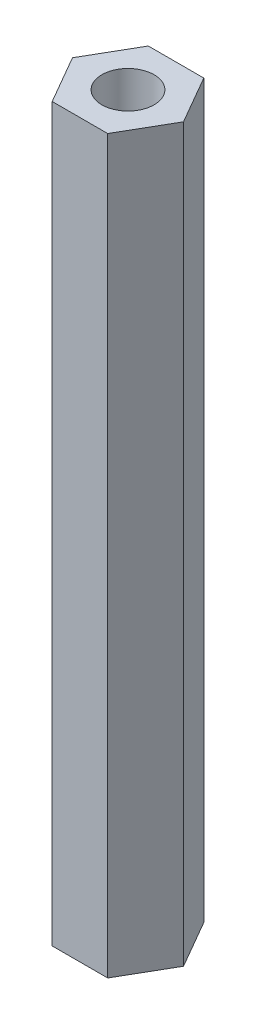
ISO-10303-21;
HEADER;
FILE_DESCRIPTION(('STEP AP214'),'2;1');
FILE_NAME('part.step','',(''),(''),'','','');
FILE_SCHEMA(('AUTOMOTIVE_DESIGN { 1 0 10303 214 1 1 1 1 }'));
ENDSEC;
DATA;
#1=APPLICATION_CONTEXT('core data for automotive mechanical design processes');
#2=APPLICATION_PROTOCOL_DEFINITION('international standard','automotive_design',2000,#1);
#3=PRODUCT_CONTEXT('',#1,'mechanical');
#4=PRODUCT('Part','Part','',(#3));
#5=PRODUCT_RELATED_PRODUCT_CATEGORY('part','',(#4));
#6=PRODUCT_DEFINITION_FORMATION('','',#4);
#7=PRODUCT_DEFINITION_CONTEXT('part definition',#1,'design');
#8=PRODUCT_DEFINITION('design','',#6,#7);
#9=PRODUCT_DEFINITION_SHAPE('','',#8);
#10=(LENGTH_UNIT() NAMED_UNIT(*) SI_UNIT(.MILLI.,.METRE.));
#11=(NAMED_UNIT(*) PLANE_ANGLE_UNIT() SI_UNIT($,.RADIAN.));
#12=(NAMED_UNIT(*) SI_UNIT($,.STERADIAN.) SOLID_ANGLE_UNIT());
#13=UNCERTAINTY_MEASURE_WITH_UNIT(LENGTH_MEASURE(1.E-05),#10,'distance_accuracy_value','');
#14=(GEOMETRIC_REPRESENTATION_CONTEXT(3) GLOBAL_UNCERTAINTY_ASSIGNED_CONTEXT((#13)) GLOBAL_UNIT_ASSIGNED_CONTEXT((#10,
#11,#12)) REPRESENTATION_CONTEXT('',''));
#15=CARTESIAN_POINT('',(0.,0.,0.));
#16=DIRECTION('',(0.,0.,1.));
#17=DIRECTION('',(1.,0.,0.));
#18=AXIS2_PLACEMENT_3D('',#15,#16,#17);
#19=CARTESIAN_POINT('',(-1.32790561913614,17.5,2.3));
#20=DIRECTION('',(0.,0.,-1.));
#21=DIRECTION('',(-1.,0.,0.));
#22=AXIS2_PLACEMENT_3D('',#19,#20,#21);
#23=PLANE('',#22);
#24=DIRECTION('',(1.,0.,0.));
#25=VECTOR('',#24,1.);
#26=CARTESIAN_POINT('',(-1.32790561913614,-17.5,2.3));
#27=LINE('',#26,#25);
#28=CARTESIAN_POINT('',(-1.32790561913614,-17.5,2.3));
#29=VERTEX_POINT('',#28);
#30=CARTESIAN_POINT('',(1.32790561913614,-17.5,2.3));
#31=VERTEX_POINT('',#30);
#32=EDGE_CURVE('E121',#29,#31,#27,.T.);
#33=ORIENTED_EDGE('',*,*,#32,.T.);
#34=DIRECTION('',(0.,-1.,0.));
#35=VECTOR('',#34,1.);
#36=CARTESIAN_POINT('',(1.32790561913614,17.5,2.3));
#37=LINE('',#36,#35);
#38=CARTESIAN_POINT('',(1.32790561913614,17.5,2.3));
#39=VERTEX_POINT('',#38);
#40=EDGE_CURVE('E11',#39,#31,#37,.T.);
#41=ORIENTED_EDGE('',*,*,#40,.F.);
#42=DIRECTION('',(1.,0.,0.));
#43=VECTOR('',#42,1.);
#44=CARTESIAN_POINT('',(-1.32790561913614,17.5,2.3));
#45=LINE('',#44,#43);
#46=CARTESIAN_POINT('',(-1.32790561913614,17.5,2.3));
#47=VERTEX_POINT('',#46);
#48=EDGE_CURVE('E132',#47,#39,#45,.T.);
#49=ORIENTED_EDGE('',*,*,#48,.F.);
#50=DIRECTION('',(0.,-1.,0.));
#51=VECTOR('',#50,1.);
#52=CARTESIAN_POINT('',(-1.32790561913614,17.5,2.3));
#53=LINE('',#52,#51);
#54=EDGE_CURVE('E117',#47,#29,#53,.T.);
#55=ORIENTED_EDGE('',*,*,#54,.T.);
#56=EDGE_LOOP('',(#33,#41,#49,#55));
#57=FACE_BOUND('',#56,.T.);
#58=ADVANCED_FACE('F37',(#57),#23,.F.);
#59=CARTESIAN_POINT('',(1.32790561913614,17.5,2.3));
#60=DIRECTION('',(-0.866025403784439,0.,-0.5));
#61=DIRECTION('',(-0.5,0.,0.866025403784439));
#62=AXIS2_PLACEMENT_3D('',#59,#60,#61);
#63=PLANE('',#62);
#64=DIRECTION('',(0.5,0.,-0.866025403784438));
#65=VECTOR('',#64,1.);
#66=CARTESIAN_POINT('',(1.32790561913614,-17.5,2.3));
#67=LINE('',#66,#65);
#68=CARTESIAN_POINT('',(2.65581123827228,-17.5,0.));
#69=VERTEX_POINT('',#68);
#70=EDGE_CURVE('E124',#31,#69,#67,.T.);
#71=ORIENTED_EDGE('',*,*,#70,.T.);
#72=DIRECTION('',(0.,-1.,0.));
#73=VECTOR('',#72,1.);
#74=CARTESIAN_POINT('',(2.65581123827228,17.5,0.));
#75=LINE('',#74,#73);
#76=CARTESIAN_POINT('',(2.65581123827228,17.5,0.));
#77=VERTEX_POINT('',#76);
#78=EDGE_CURVE('E45',#77,#69,#75,.T.);
#79=ORIENTED_EDGE('',*,*,#78,.F.);
#80=DIRECTION('',(0.5,0.,-0.866025403784438));
#81=VECTOR('',#80,1.);
#82=CARTESIAN_POINT('',(1.32790561913614,17.5,2.3));
#83=LINE('',#82,#81);
#84=EDGE_CURVE('E90',#39,#77,#83,.T.);
#85=ORIENTED_EDGE('',*,*,#84,.F.);
#86=ORIENTED_EDGE('',*,*,#40,.T.);
#87=EDGE_LOOP('',(#71,#79,#85,#86));
#88=FACE_BOUND('',#87,.T.);
#89=ADVANCED_FACE('F157',(#88),#63,.F.);
#90=CARTESIAN_POINT('',(2.65581123827228,17.5,0.));
#91=DIRECTION('',(-0.866025403784439,0.,0.5));
#92=DIRECTION('',(0.5,0.,0.866025403784439));
#93=AXIS2_PLACEMENT_3D('',#90,#91,#92);
#94=PLANE('',#93);
#95=DIRECTION('',(-0.5,0.,-0.866025403784439));
#96=VECTOR('',#95,1.);
#97=CARTESIAN_POINT('',(2.65581123827228,-17.5,0.));
#98=LINE('',#97,#96);
#99=CARTESIAN_POINT('',(1.32790561913614,-17.5,-2.3));
#100=VERTEX_POINT('',#99);
#101=EDGE_CURVE('E127',#69,#100,#98,.T.);
#102=ORIENTED_EDGE('',*,*,#101,.T.);
#103=DIRECTION('',(0.,-1.,0.));
#104=VECTOR('',#103,1.);
#105=CARTESIAN_POINT('',(1.32790561913614,17.5,-2.3));
#106=LINE('',#105,#104);
#107=CARTESIAN_POINT('',(1.32790561913614,17.5,-2.3));
#108=VERTEX_POINT('',#107);
#109=EDGE_CURVE('E112',#108,#100,#106,.T.);
#110=ORIENTED_EDGE('',*,*,#109,.F.);
#111=DIRECTION('',(-0.5,0.,-0.866025403784439));
#112=VECTOR('',#111,1.);
#113=CARTESIAN_POINT('',(2.65581123827228,17.5,0.));
#114=LINE('',#113,#112);
#115=EDGE_CURVE('E103',#77,#108,#114,.T.);
#116=ORIENTED_EDGE('',*,*,#115,.F.);
#117=ORIENTED_EDGE('',*,*,#78,.T.);
#118=EDGE_LOOP('',(#102,#110,#116,#117));
#119=FACE_BOUND('',#118,.T.);
#120=ADVANCED_FACE('F138',(#119),#94,.F.);
#121=CARTESIAN_POINT('',(1.32790561913614,17.5,-2.3));
#122=DIRECTION('',(0.,0.,1.));
#123=DIRECTION('',(1.,0.,0.));
#124=AXIS2_PLACEMENT_3D('',#121,#122,#123);
#125=PLANE('',#124);
#126=DIRECTION('',(-1.,0.,0.));
#127=VECTOR('',#126,1.);
#128=CARTESIAN_POINT('',(1.32790561913614,-17.5,-2.3));
#129=LINE('',#128,#127);
#130=CARTESIAN_POINT('',(-1.32790561913614,-17.5,-2.3));
#131=VERTEX_POINT('',#130);
#132=EDGE_CURVE('E111',#100,#131,#129,.T.);
#133=ORIENTED_EDGE('',*,*,#132,.T.);
#134=DIRECTION('',(0.,-1.,0.));
#135=VECTOR('',#134,1.);
#136=CARTESIAN_POINT('',(-1.32790561913614,17.5,-2.3));
#137=LINE('',#136,#135);
#138=CARTESIAN_POINT('',(-1.32790561913614,17.5,-2.3));
#139=VERTEX_POINT('',#138);
#140=EDGE_CURVE('E108',#139,#131,#137,.T.);
#141=ORIENTED_EDGE('',*,*,#140,.F.);
#142=DIRECTION('',(-1.,0.,0.));
#143=VECTOR('',#142,1.);
#144=CARTESIAN_POINT('',(1.32790561913614,17.5,-2.3));
#145=LINE('',#144,#143);
#146=EDGE_CURVE('E97',#108,#139,#145,.T.);
#147=ORIENTED_EDGE('',*,*,#146,.F.);
#148=ORIENTED_EDGE('',*,*,#109,.T.);
#149=EDGE_LOOP('',(#133,#141,#147,#148));
#150=FACE_BOUND('',#149,.T.);
#151=ADVANCED_FACE('F109',(#150),#125,.F.);
#152=CARTESIAN_POINT('',(-1.32790561913614,17.5,-2.3));
#153=DIRECTION('',(0.866025403784439,0.,0.5));
#154=DIRECTION('',(0.5,0.,-0.866025403784439));
#155=AXIS2_PLACEMENT_3D('',#152,#153,#154);
#156=PLANE('',#155);
#157=DIRECTION('',(-0.5,0.,0.866025403784439));
#158=VECTOR('',#157,1.);
#159=CARTESIAN_POINT('',(-1.32790561913614,-17.5,-2.3));
#160=LINE('',#159,#158);
#161=CARTESIAN_POINT('',(-2.65581123827228,-17.5,0.));
#162=VERTEX_POINT('',#161);
#163=EDGE_CURVE('E76',#131,#162,#160,.T.);
#164=ORIENTED_EDGE('',*,*,#163,.T.);
#165=DIRECTION('',(0.,-1.,0.));
#166=VECTOR('',#165,1.);
#167=CARTESIAN_POINT('',(-2.65581123827228,17.5,0.));
#168=LINE('',#167,#166);
#169=CARTESIAN_POINT('',(-2.65581123827228,17.5,0.));
#170=VERTEX_POINT('',#169);
#171=EDGE_CURVE('E113',#170,#162,#168,.T.);
#172=ORIENTED_EDGE('',*,*,#171,.F.);
#173=DIRECTION('',(-0.5,0.,0.866025403784439));
#174=VECTOR('',#173,1.);
#175=CARTESIAN_POINT('',(-1.32790561913614,17.5,-2.3));
#176=LINE('',#175,#174);
#177=EDGE_CURVE('E101',#139,#170,#176,.T.);
#178=ORIENTED_EDGE('',*,*,#177,.F.);
#179=ORIENTED_EDGE('',*,*,#140,.T.);
#180=EDGE_LOOP('',(#164,#172,#178,#179));
#181=FACE_BOUND('',#180,.T.);
#182=ADVANCED_FACE('F115',(#181),#156,.F.);
#183=CARTESIAN_POINT('',(-2.65581123827228,17.5,0.));
#184=DIRECTION('',(0.866025403784439,0.,-0.5));
#185=DIRECTION('',(-0.5,0.,-0.866025403784439));
#186=AXIS2_PLACEMENT_3D('',#183,#184,#185);
#187=PLANE('',#186);
#188=DIRECTION('',(0.5,0.,0.866025403784439));
#189=VECTOR('',#188,1.);
#190=CARTESIAN_POINT('',(-2.65581123827228,-17.5,0.));
#191=LINE('',#190,#189);
#192=EDGE_CURVE('E82',#162,#29,#191,.T.);
#193=ORIENTED_EDGE('',*,*,#192,.T.);
#194=ORIENTED_EDGE('',*,*,#54,.F.);
#195=DIRECTION('',(0.5,0.,0.866025403784439));
#196=VECTOR('',#195,1.);
#197=CARTESIAN_POINT('',(-2.65581123827228,17.5,0.));
#198=LINE('',#197,#196);
#199=EDGE_CURVE('E53',#170,#47,#198,.T.);
#200=ORIENTED_EDGE('',*,*,#199,.F.);
#201=ORIENTED_EDGE('',*,*,#171,.T.);
#202=EDGE_LOOP('',(#193,#194,#200,#201));
#203=FACE_BOUND('',#202,.T.);
#204=ADVANCED_FACE('F145',(#203),#187,.F.);
#205=CARTESIAN_POINT('',(0.,17.5,0.));
#206=DIRECTION('',(0.,1.,0.));
#207=DIRECTION('',(0.,0.,1.));
#208=AXIS2_PLACEMENT_3D('',#205,#206,#207);
#209=PLANE('',#208);
#210=CARTESIAN_POINT('',(0.,17.5,0.));
#211=DIRECTION('',(0.,1.,0.));
#212=DIRECTION('',(0.,0.,1.));
#213=AXIS2_PLACEMENT_3D('',#210,#211,#212);
#214=CIRCLE('',#213,1.25);
#215=CARTESIAN_POINT('',(0.,17.5,1.25));
#216=VERTEX_POINT('',#215);
#217=EDGE_CURVE('E226',#216,#216,#214,.T.);
#218=ORIENTED_EDGE('',*,*,#217,.F.);
#219=EDGE_LOOP('',(#218));
#220=FACE_BOUND('',#219,.T.);
#221=ORIENTED_EDGE('',*,*,#48,.T.);
#222=ORIENTED_EDGE('',*,*,#84,.T.);
#223=ORIENTED_EDGE('',*,*,#115,.T.);
#224=ORIENTED_EDGE('',*,*,#146,.T.);
#225=ORIENTED_EDGE('',*,*,#177,.T.);
#226=ORIENTED_EDGE('',*,*,#199,.T.);
#227=EDGE_LOOP('',(#221,#222,#223,#224,#225,#226));
#228=FACE_BOUND('',#227,.T.);
#229=ADVANCED_FACE('F99',(#220,#228),#209,.T.);
#230=CARTESIAN_POINT('',(0.,-17.5,0.));
#231=DIRECTION('',(0.,1.,0.));
#232=DIRECTION('',(0.,0.,1.));
#233=AXIS2_PLACEMENT_3D('',#230,#231,#232);
#234=PLANE('',#233);
#235=CARTESIAN_POINT('',(0.,-17.5,0.));
#236=DIRECTION('',(0.,1.,0.));
#237=DIRECTION('',(0.,0.,1.));
#238=AXIS2_PLACEMENT_3D('',#235,#236,#237);
#239=CIRCLE('',#238,1.24999999999999);
#240=CARTESIAN_POINT('',(0.,-17.5,1.24999999999999));
#241=VERTEX_POINT('',#240);
#242=EDGE_CURVE('E125',#241,#241,#239,.T.);
#243=ORIENTED_EDGE('',*,*,#242,.T.);
#244=EDGE_LOOP('',(#243));
#245=FACE_BOUND('',#244,.T.);
#246=ORIENTED_EDGE('',*,*,#32,.F.);
#247=ORIENTED_EDGE('',*,*,#192,.F.);
#248=ORIENTED_EDGE('',*,*,#163,.F.);
#249=ORIENTED_EDGE('',*,*,#132,.F.);
#250=ORIENTED_EDGE('',*,*,#101,.F.);
#251=ORIENTED_EDGE('',*,*,#70,.F.);
#252=EDGE_LOOP('',(#246,#247,#248,#249,#250,#251));
#253=FACE_BOUND('',#252,.T.);
#254=ADVANCED_FACE('F141',(#245,#253),#234,.F.);
#255=CARTESIAN_POINT('',(0.,17.5,0.));
#256=DIRECTION('',(0.,1.,0.));
#257=DIRECTION('',(0.,0.,1.));
#258=AXIS2_PLACEMENT_3D('',#255,#256,#257);
#259=CYLINDRICAL_SURFACE('',#258,1.24999999999999);
#260=ORIENTED_EDGE('',*,*,#242,.F.);
#261=EDGE_LOOP('',(#260));
#262=FACE_BOUND('',#261,.T.);
#263=ORIENTED_EDGE('',*,*,#217,.T.);
#264=EDGE_LOOP('',(#263));
#265=FACE_BOUND('',#264,.T.);
#266=ADVANCED_FACE('F194',(#262,#265),#259,.F.);
#267=CLOSED_SHELL('',(#58,#89,#120,#151,#182,#204,#229,#254,#266));
#268=MANIFOLD_SOLID_BREP('B2',#267);
#269=ADVANCED_BREP_SHAPE_REPRESENTATION('',(#18,#268),#14);
#270=SHAPE_DEFINITION_REPRESENTATION(#9,#269);
ENDSEC;
END-ISO-10303-21;
